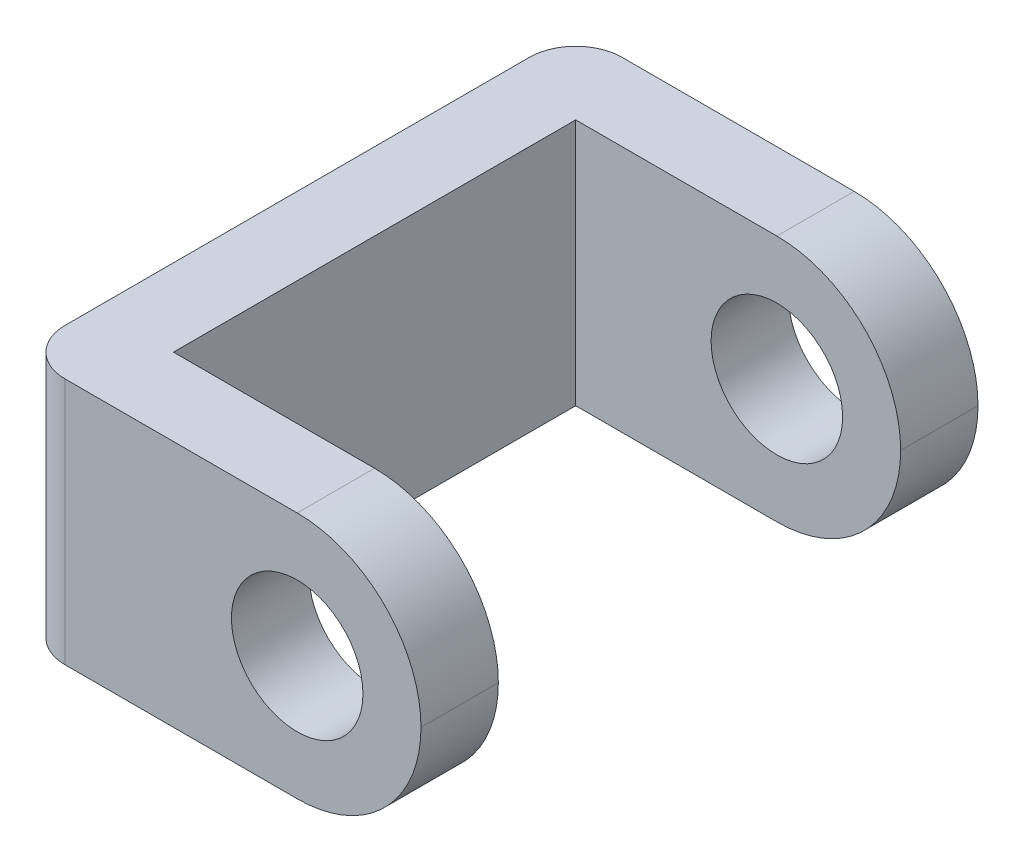
ISO-10303-21;
HEADER;
FILE_DESCRIPTION(('STEP AP214'),'2;1');
FILE_NAME('part.step','',(''),(''),'','','');
FILE_SCHEMA(('AUTOMOTIVE_DESIGN { 1 0 10303 214 1 1 1 1 }'));
ENDSEC;
DATA;
#1=APPLICATION_CONTEXT('core data for automotive mechanical design processes');
#2=APPLICATION_PROTOCOL_DEFINITION('international standard','automotive_design',2000,#1);
#3=PRODUCT_CONTEXT('',#1,'mechanical');
#4=PRODUCT('Part','Part','',(#3));
#5=PRODUCT_RELATED_PRODUCT_CATEGORY('part','',(#4));
#6=PRODUCT_DEFINITION_FORMATION('','',#4);
#7=PRODUCT_DEFINITION_CONTEXT('part definition',#1,'design');
#8=PRODUCT_DEFINITION('design','',#6,#7);
#9=PRODUCT_DEFINITION_SHAPE('','',#8);
#10=(LENGTH_UNIT() NAMED_UNIT(*) SI_UNIT(.MILLI.,.METRE.));
#11=(NAMED_UNIT(*) PLANE_ANGLE_UNIT() SI_UNIT($,.RADIAN.));
#12=(NAMED_UNIT(*) SI_UNIT($,.STERADIAN.) SOLID_ANGLE_UNIT());
#13=UNCERTAINTY_MEASURE_WITH_UNIT(LENGTH_MEASURE(1.E-05),#10,'distance_accuracy_value','');
#14=(GEOMETRIC_REPRESENTATION_CONTEXT(3) GLOBAL_UNCERTAINTY_ASSIGNED_CONTEXT((#13)) GLOBAL_UNIT_ASSIGNED_CONTEXT((#10,
#11,#12)) REPRESENTATION_CONTEXT('',''));
#15=CARTESIAN_POINT('',(0.,0.,0.));
#16=DIRECTION('',(0.,0.,1.));
#17=DIRECTION('',(1.,0.,0.));
#18=AXIS2_PLACEMENT_3D('',#15,#16,#17);
#19=CARTESIAN_POINT('',(26.,16.,-18.));
#20=DIRECTION('',(0.,0.,1.));
#21=DIRECTION('',(1.,0.,0.));
#22=AXIS2_PLACEMENT_3D('',#19,#20,#21);
#23=PLANE('',#22);
#24=CARTESIAN_POINT('',(18.,8.,-18.));
#25=DIRECTION('',(0.,0.,1.));
#26=DIRECTION('',(1.,0.,0.));
#27=AXIS2_PLACEMENT_3D('',#24,#25,#26);
#28=CIRCLE('',#27,4.25);
#29=CARTESIAN_POINT('',(22.25,8.,-18.));
#30=VERTEX_POINT('',#29);
#31=EDGE_CURVE('E294',#30,#30,#28,.T.);
#32=ORIENTED_EDGE('',*,*,#31,.T.);
#33=EDGE_LOOP('',(#32));
#34=FACE_BOUND('',#33,.T.);
#35=DIRECTION('',(-1.,0.,0.));
#36=VECTOR('',#35,1.);
#37=CARTESIAN_POINT('',(26.,0.,-18.));
#38=LINE('',#37,#36);
#39=CARTESIAN_POINT('',(18.,0.,-18.));
#40=VERTEX_POINT('',#39);
#41=CARTESIAN_POINT('',(3.,0.,-18.));
#42=VERTEX_POINT('',#41);
#43=EDGE_CURVE('E156',#40,#42,#38,.T.);
#44=ORIENTED_EDGE('',*,*,#43,.T.);
#45=DIRECTION('',(0.,-1.,0.));
#46=VECTOR('',#45,1.);
#47=CARTESIAN_POINT('',(3.,16.,-18.));
#48=LINE('',#47,#46);
#49=CARTESIAN_POINT('',(3.,16.,-18.));
#50=VERTEX_POINT('',#49);
#51=EDGE_CURVE('E11',#42,#50,#48,.F.);
#52=ORIENTED_EDGE('',*,*,#51,.T.);
#53=DIRECTION('',(-1.,0.,0.));
#54=VECTOR('',#53,1.);
#55=CARTESIAN_POINT('',(26.,16.,-18.));
#56=LINE('',#55,#54);
#57=CARTESIAN_POINT('',(18.,16.,-18.));
#58=VERTEX_POINT('',#57);
#59=EDGE_CURVE('E169',#58,#50,#56,.T.);
#60=ORIENTED_EDGE('',*,*,#59,.F.);
#61=CARTESIAN_POINT('',(18.,8.,-18.));
#62=DIRECTION('',(0.,0.,1.));
#63=DIRECTION('',(1.,0.,0.));
#64=AXIS2_PLACEMENT_3D('',#61,#62,#63);
#65=CIRCLE('',#64,8.);
#66=CARTESIAN_POINT('',(26.,8.,-18.));
#67=VERTEX_POINT('',#66);
#68=EDGE_CURVE('E145',#58,#67,#65,.F.);
#69=ORIENTED_EDGE('',*,*,#68,.T.);
#70=CARTESIAN_POINT('',(18.,8.,-18.));
#71=DIRECTION('',(0.,0.,1.));
#72=DIRECTION('',(1.,0.,0.));
#73=AXIS2_PLACEMENT_3D('',#70,#71,#72);
#74=CIRCLE('',#73,8.);
#75=EDGE_CURVE('E172',#67,#40,#74,.F.);
#76=ORIENTED_EDGE('',*,*,#75,.T.);
#77=EDGE_LOOP('',(#44,#52,#60,#69,#76));
#78=FACE_BOUND('',#77,.T.);
#79=ADVANCED_FACE('F34',(#34,#78),#23,.F.);
#80=CARTESIAN_POINT('',(0.,16.,-18.));
#81=DIRECTION('',(1.,0.,0.));
#82=DIRECTION('',(0.,0.,-1.));
#83=AXIS2_PLACEMENT_3D('',#80,#81,#82);
#84=PLANE('',#83);
#85=DIRECTION('',(0.,0.,1.));
#86=VECTOR('',#85,1.);
#87=CARTESIAN_POINT('',(0.,0.,-18.));
#88=LINE('',#87,#86);
#89=CARTESIAN_POINT('',(0.,0.,-15.));
#90=VERTEX_POINT('',#89);
#91=CARTESIAN_POINT('',(0.,0.,15.));
#92=VERTEX_POINT('',#91);
#93=EDGE_CURVE('E158',#90,#92,#88,.T.);
#94=ORIENTED_EDGE('',*,*,#93,.T.);
#95=DIRECTION('',(0.,-1.,0.));
#96=VECTOR('',#95,1.);
#97=CARTESIAN_POINT('',(0.,16.,15.));
#98=LINE('',#97,#96);
#99=CARTESIAN_POINT('',(0.,16.,15.));
#100=VERTEX_POINT('',#99);
#101=EDGE_CURVE('E56',#92,#100,#98,.F.);
#102=ORIENTED_EDGE('',*,*,#101,.T.);
#103=DIRECTION('',(0.,0.,1.));
#104=VECTOR('',#103,1.);
#105=CARTESIAN_POINT('',(0.,16.,-18.));
#106=LINE('',#105,#104);
#107=CARTESIAN_POINT('',(0.,16.,-15.));
#108=VERTEX_POINT('',#107);
#109=EDGE_CURVE('E217',#108,#100,#106,.T.);
#110=ORIENTED_EDGE('',*,*,#109,.F.);
#111=DIRECTION('',(0.,-1.,0.));
#112=VECTOR('',#111,1.);
#113=CARTESIAN_POINT('',(0.,16.,-15.));
#114=LINE('',#113,#112);
#115=EDGE_CURVE('E209',#108,#90,#114,.T.);
#116=ORIENTED_EDGE('',*,*,#115,.T.);
#117=EDGE_LOOP('',(#94,#102,#110,#116));
#118=FACE_BOUND('',#117,.T.);
#119=ADVANCED_FACE('F228',(#118),#84,.F.);
#120=CARTESIAN_POINT('',(0.,16.,18.));
#121=DIRECTION('',(0.,0.,-1.));
#122=DIRECTION('',(-1.,0.,0.));
#123=AXIS2_PLACEMENT_3D('',#120,#121,#122);
#124=PLANE('',#123);
#125=CARTESIAN_POINT('',(18.,8.,18.));
#126=DIRECTION('',(0.,0.,1.));
#127=DIRECTION('',(1.,0.,0.));
#128=AXIS2_PLACEMENT_3D('',#125,#126,#127);
#129=CIRCLE('',#128,4.25);
#130=CARTESIAN_POINT('',(22.25,8.,18.));
#131=VERTEX_POINT('',#130);
#132=EDGE_CURVE('E289',#131,#131,#129,.T.);
#133=ORIENTED_EDGE('',*,*,#132,.F.);
#134=EDGE_LOOP('',(#133));
#135=FACE_BOUND('',#134,.T.);
#136=DIRECTION('',(1.,0.,0.));
#137=VECTOR('',#136,1.);
#138=CARTESIAN_POINT('',(0.,16.,18.));
#139=LINE('',#138,#137);
#140=CARTESIAN_POINT('',(3.,16.,18.));
#141=VERTEX_POINT('',#140);
#142=CARTESIAN_POINT('',(18.,16.,18.));
#143=VERTEX_POINT('',#142);
#144=EDGE_CURVE('E136',#141,#143,#139,.T.);
#145=ORIENTED_EDGE('',*,*,#144,.F.);
#146=DIRECTION('',(0.,-1.,0.));
#147=VECTOR('',#146,1.);
#148=CARTESIAN_POINT('',(3.,16.,18.));
#149=LINE('',#148,#147);
#150=CARTESIAN_POINT('',(3.,0.,18.));
#151=VERTEX_POINT('',#150);
#152=EDGE_CURVE('E196',#141,#151,#149,.T.);
#153=ORIENTED_EDGE('',*,*,#152,.T.);
#154=DIRECTION('',(1.,0.,0.));
#155=VECTOR('',#154,1.);
#156=CARTESIAN_POINT('',(0.,0.,18.));
#157=LINE('',#156,#155);
#158=CARTESIAN_POINT('',(18.,0.,18.));
#159=VERTEX_POINT('',#158);
#160=EDGE_CURVE('E161',#151,#159,#157,.T.);
#161=ORIENTED_EDGE('',*,*,#160,.T.);
#162=CARTESIAN_POINT('',(18.,8.,18.));
#163=DIRECTION('',(0.,0.,-1.));
#164=DIRECTION('',(-1.,0.,0.));
#165=AXIS2_PLACEMENT_3D('',#162,#163,#164);
#166=CIRCLE('',#165,8.);
#167=CARTESIAN_POINT('',(26.,8.,18.));
#168=VERTEX_POINT('',#167);
#169=EDGE_CURVE('E194',#159,#168,#166,.F.);
#170=ORIENTED_EDGE('',*,*,#169,.T.);
#171=CARTESIAN_POINT('',(18.,8.,18.));
#172=DIRECTION('',(0.,0.,-1.));
#173=DIRECTION('',(-1.,0.,0.));
#174=AXIS2_PLACEMENT_3D('',#171,#172,#173);
#175=CIRCLE('',#174,8.);
#176=EDGE_CURVE('E191',#168,#143,#175,.F.);
#177=ORIENTED_EDGE('',*,*,#176,.T.);
#178=EDGE_LOOP('',(#145,#153,#161,#170,#177));
#179=FACE_BOUND('',#178,.T.);
#180=ADVANCED_FACE('F221',(#135,#179),#124,.F.);
#181=CARTESIAN_POINT('',(26.,16.,13.));
#182=DIRECTION('',(0.,0.,1.));
#183=DIRECTION('',(1.,0.,0.));
#184=AXIS2_PLACEMENT_3D('',#181,#182,#183);
#185=PLANE('',#184);
#186=CARTESIAN_POINT('',(18.,8.,13.));
#187=DIRECTION('',(0.,0.,1.));
#188=DIRECTION('',(1.,0.,0.));
#189=AXIS2_PLACEMENT_3D('',#186,#187,#188);
#190=CIRCLE('',#189,4.25);
#191=CARTESIAN_POINT('',(22.25,8.,13.));
#192=VERTEX_POINT('',#191);
#193=EDGE_CURVE('E202',#192,#192,#190,.T.);
#194=ORIENTED_EDGE('',*,*,#193,.T.);
#195=EDGE_LOOP('',(#194));
#196=FACE_BOUND('',#195,.T.);
#197=CARTESIAN_POINT('',(18.,8.,13.));
#198=DIRECTION('',(0.,0.,1.));
#199=DIRECTION('',(1.,0.,0.));
#200=AXIS2_PLACEMENT_3D('',#197,#198,#199);
#201=CIRCLE('',#200,8.);
#202=CARTESIAN_POINT('',(18.,16.,13.));
#203=VERTEX_POINT('',#202);
#204=CARTESIAN_POINT('',(26.,8.,13.));
#205=VERTEX_POINT('',#204);
#206=EDGE_CURVE('E187',#203,#205,#201,.F.);
#207=ORIENTED_EDGE('',*,*,#206,.T.);
#208=CARTESIAN_POINT('',(18.,8.,13.));
#209=DIRECTION('',(0.,0.,1.));
#210=DIRECTION('',(1.,0.,0.));
#211=AXIS2_PLACEMENT_3D('',#208,#209,#210);
#212=CIRCLE('',#211,8.);
#213=CARTESIAN_POINT('',(18.,0.,13.));
#214=VERTEX_POINT('',#213);
#215=EDGE_CURVE('E189',#205,#214,#212,.F.);
#216=ORIENTED_EDGE('',*,*,#215,.T.);
#217=DIRECTION('',(-1.,0.,0.));
#218=VECTOR('',#217,1.);
#219=CARTESIAN_POINT('',(26.,0.,13.));
#220=LINE('',#219,#218);
#221=CARTESIAN_POINT('',(5.,0.,13.));
#222=VERTEX_POINT('',#221);
#223=EDGE_CURVE('E142',#214,#222,#220,.T.);
#224=ORIENTED_EDGE('',*,*,#223,.T.);
#225=DIRECTION('',(0.,-1.,0.));
#226=VECTOR('',#225,1.);
#227=CARTESIAN_POINT('',(5.,16.,13.));
#228=LINE('',#227,#226);
#229=CARTESIAN_POINT('',(5.,16.,13.));
#230=VERTEX_POINT('',#229);
#231=EDGE_CURVE('E139',#230,#222,#228,.T.);
#232=ORIENTED_EDGE('',*,*,#231,.F.);
#233=DIRECTION('',(-1.,0.,0.));
#234=VECTOR('',#233,1.);
#235=CARTESIAN_POINT('',(26.,16.,13.));
#236=LINE('',#235,#234);
#237=EDGE_CURVE('E125',#203,#230,#236,.T.);
#238=ORIENTED_EDGE('',*,*,#237,.F.);
#239=EDGE_LOOP('',(#207,#216,#224,#232,#238));
#240=FACE_BOUND('',#239,.T.);
#241=ADVANCED_FACE('F140',(#196,#240),#185,.F.);
#242=CARTESIAN_POINT('',(5.,16.,13.));
#243=DIRECTION('',(-1.,0.,0.));
#244=DIRECTION('',(0.,0.,1.));
#245=AXIS2_PLACEMENT_3D('',#242,#243,#244);
#246=PLANE('',#245);
#247=DIRECTION('',(0.,0.,-1.));
#248=VECTOR('',#247,1.);
#249=CARTESIAN_POINT('',(5.,0.,13.));
#250=LINE('',#249,#248);
#251=CARTESIAN_POINT('',(5.,0.,-13.));
#252=VERTEX_POINT('',#251);
#253=EDGE_CURVE('E164',#222,#252,#250,.T.);
#254=ORIENTED_EDGE('',*,*,#253,.T.);
#255=DIRECTION('',(0.,-1.,0.));
#256=VECTOR('',#255,1.);
#257=CARTESIAN_POINT('',(5.,16.,-13.));
#258=LINE('',#257,#256);
#259=CARTESIAN_POINT('',(5.,16.,-13.));
#260=VERTEX_POINT('',#259);
#261=EDGE_CURVE('E146',#260,#252,#258,.T.);
#262=ORIENTED_EDGE('',*,*,#261,.F.);
#263=DIRECTION('',(0.,0.,-1.));
#264=VECTOR('',#263,1.);
#265=CARTESIAN_POINT('',(5.,16.,13.));
#266=LINE('',#265,#264);
#267=EDGE_CURVE('E130',#230,#260,#266,.T.);
#268=ORIENTED_EDGE('',*,*,#267,.F.);
#269=ORIENTED_EDGE('',*,*,#231,.T.);
#270=EDGE_LOOP('',(#254,#262,#268,#269));
#271=FACE_BOUND('',#270,.T.);
#272=ADVANCED_FACE('F148',(#271),#246,.F.);
#273=CARTESIAN_POINT('',(5.,16.,-13.));
#274=DIRECTION('',(0.,0.,-1.));
#275=DIRECTION('',(-1.,0.,0.));
#276=AXIS2_PLACEMENT_3D('',#273,#274,#275);
#277=PLANE('',#276);
#278=CARTESIAN_POINT('',(18.,8.,-13.));
#279=DIRECTION('',(0.,0.,-1.));
#280=DIRECTION('',(-1.,0.,0.));
#281=AXIS2_PLACEMENT_3D('',#278,#279,#280);
#282=CIRCLE('',#281,4.25);
#283=CARTESIAN_POINT('',(13.75,8.,-13.));
#284=VERTEX_POINT('',#283);
#285=EDGE_CURVE('E38',#284,#284,#282,.T.);
#286=ORIENTED_EDGE('',*,*,#285,.T.);
#287=EDGE_LOOP('',(#286));
#288=FACE_BOUND('',#287,.T.);
#289=DIRECTION('',(1.,0.,0.));
#290=VECTOR('',#289,1.);
#291=CARTESIAN_POINT('',(5.,0.,-13.));
#292=LINE('',#291,#290);
#293=CARTESIAN_POINT('',(18.,0.,-13.));
#294=VERTEX_POINT('',#293);
#295=EDGE_CURVE('E166',#252,#294,#292,.T.);
#296=ORIENTED_EDGE('',*,*,#295,.T.);
#297=CARTESIAN_POINT('',(18.,8.,-13.));
#298=DIRECTION('',(0.,0.,-1.));
#299=DIRECTION('',(-1.,0.,0.));
#300=AXIS2_PLACEMENT_3D('',#297,#298,#299);
#301=CIRCLE('',#300,8.);
#302=CARTESIAN_POINT('',(26.,8.,-13.));
#303=VERTEX_POINT('',#302);
#304=EDGE_CURVE('E182',#294,#303,#301,.F.);
#305=ORIENTED_EDGE('',*,*,#304,.T.);
#306=CARTESIAN_POINT('',(18.,8.,-13.));
#307=DIRECTION('',(0.,0.,-1.));
#308=DIRECTION('',(-1.,0.,0.));
#309=AXIS2_PLACEMENT_3D('',#306,#307,#308);
#310=CIRCLE('',#309,8.);
#311=CARTESIAN_POINT('',(18.,16.,-13.));
#312=VERTEX_POINT('',#311);
#313=EDGE_CURVE('E180',#303,#312,#310,.F.);
#314=ORIENTED_EDGE('',*,*,#313,.T.);
#315=DIRECTION('',(1.,0.,0.));
#316=VECTOR('',#315,1.);
#317=CARTESIAN_POINT('',(5.,16.,-13.));
#318=LINE('',#317,#316);
#319=EDGE_CURVE('E151',#260,#312,#318,.T.);
#320=ORIENTED_EDGE('',*,*,#319,.F.);
#321=ORIENTED_EDGE('',*,*,#261,.T.);
#322=EDGE_LOOP('',(#296,#305,#314,#320,#321));
#323=FACE_BOUND('',#322,.T.);
#324=ADVANCED_FACE('F241',(#288,#323),#277,.F.);
#325=CARTESIAN_POINT('',(0.,16.,0.));
#326=DIRECTION('',(0.,1.,0.));
#327=DIRECTION('',(0.,0.,1.));
#328=AXIS2_PLACEMENT_3D('',#325,#326,#327);
#329=PLANE('',#328);
#330=ORIENTED_EDGE('',*,*,#109,.T.);
#331=CARTESIAN_POINT('',(3.,16.,15.));
#332=DIRECTION('',(0.,1.,0.));
#333=DIRECTION('',(0.,0.,1.));
#334=AXIS2_PLACEMENT_3D('',#331,#332,#333);
#335=CIRCLE('',#334,3.);
#336=EDGE_CURVE('E43',#100,#141,#335,.T.);
#337=ORIENTED_EDGE('',*,*,#336,.T.);
#338=ORIENTED_EDGE('',*,*,#144,.T.);
#339=DIRECTION('',(0.,0.,-1.));
#340=VECTOR('',#339,1.);
#341=CARTESIAN_POINT('',(18.,16.,13.));
#342=LINE('',#341,#340);
#343=EDGE_CURVE('E133',#143,#203,#342,.T.);
#344=ORIENTED_EDGE('',*,*,#343,.T.);
#345=ORIENTED_EDGE('',*,*,#237,.T.);
#346=ORIENTED_EDGE('',*,*,#267,.T.);
#347=ORIENTED_EDGE('',*,*,#319,.T.);
#348=DIRECTION('',(0.,0.,-1.));
#349=VECTOR('',#348,1.);
#350=CARTESIAN_POINT('',(18.,16.,-18.));
#351=LINE('',#350,#349);
#352=EDGE_CURVE('E185',#312,#58,#351,.T.);
#353=ORIENTED_EDGE('',*,*,#352,.T.);
#354=ORIENTED_EDGE('',*,*,#59,.T.);
#355=CARTESIAN_POINT('',(3.,16.,-15.));
#356=DIRECTION('',(0.,1.,0.));
#357=DIRECTION('',(0.,0.,1.));
#358=AXIS2_PLACEMENT_3D('',#355,#356,#357);
#359=CIRCLE('',#358,3.);
#360=EDGE_CURVE('E213',#50,#108,#359,.T.);
#361=ORIENTED_EDGE('',*,*,#360,.T.);
#362=EDGE_LOOP('',(#330,#337,#338,#344,#345,#346,#347,#353,#354,#361));
#363=FACE_BOUND('',#362,.T.);
#364=ADVANCED_FACE('F127',(#363),#329,.T.);
#365=CARTESIAN_POINT('',(0.,0.,0.));
#366=DIRECTION('',(0.,1.,0.));
#367=DIRECTION('',(0.,0.,1.));
#368=AXIS2_PLACEMENT_3D('',#365,#366,#367);
#369=PLANE('',#368);
#370=ORIENTED_EDGE('',*,*,#160,.F.);
#371=CARTESIAN_POINT('',(3.,0.,15.));
#372=DIRECTION('',(0.,1.,0.));
#373=DIRECTION('',(0.,0.,1.));
#374=AXIS2_PLACEMENT_3D('',#371,#372,#373);
#375=CIRCLE('',#374,3.);
#376=EDGE_CURVE('E207',#151,#92,#375,.F.);
#377=ORIENTED_EDGE('',*,*,#376,.T.);
#378=ORIENTED_EDGE('',*,*,#93,.F.);
#379=CARTESIAN_POINT('',(3.,0.,-15.));
#380=DIRECTION('',(0.,1.,0.));
#381=DIRECTION('',(0.,0.,1.));
#382=AXIS2_PLACEMENT_3D('',#379,#380,#381);
#383=CIRCLE('',#382,3.);
#384=EDGE_CURVE('E205',#90,#42,#383,.F.);
#385=ORIENTED_EDGE('',*,*,#384,.T.);
#386=ORIENTED_EDGE('',*,*,#43,.F.);
#387=DIRECTION('',(0.,0.,-1.));
#388=VECTOR('',#387,1.);
#389=CARTESIAN_POINT('',(18.,0.,0.));
#390=LINE('',#389,#388);
#391=EDGE_CURVE('E177',#40,#294,#390,.F.);
#392=ORIENTED_EDGE('',*,*,#391,.T.);
#393=ORIENTED_EDGE('',*,*,#295,.F.);
#394=ORIENTED_EDGE('',*,*,#253,.F.);
#395=ORIENTED_EDGE('',*,*,#223,.F.);
#396=DIRECTION('',(0.,0.,-1.));
#397=VECTOR('',#396,1.);
#398=CARTESIAN_POINT('',(18.,0.,0.));
#399=LINE('',#398,#397);
#400=EDGE_CURVE('E174',#214,#159,#399,.F.);
#401=ORIENTED_EDGE('',*,*,#400,.T.);
#402=EDGE_LOOP('',(#370,#377,#378,#385,#386,#392,#393,#394,#395,#401));
#403=FACE_BOUND('',#402,.T.);
#404=ADVANCED_FACE('F227',(#403),#369,.F.);
#405=CARTESIAN_POINT('',(18.,8.,0.));
#406=DIRECTION('',(0.,0.,1.));
#407=DIRECTION('',(1.,0.,0.));
#408=AXIS2_PLACEMENT_3D('',#405,#406,#407);
#409=CYLINDRICAL_SURFACE('',#408,8.);
#410=ORIENTED_EDGE('',*,*,#352,.F.);
#411=ORIENTED_EDGE('',*,*,#313,.F.);
#412=DIRECTION('',(0.,0.,-1.));
#413=VECTOR('',#412,1.);
#414=CARTESIAN_POINT('',(26.,8.,-13.));
#415=LINE('',#414,#413);
#416=EDGE_CURVE('E159',#67,#303,#415,.F.);
#417=ORIENTED_EDGE('',*,*,#416,.F.);
#418=ORIENTED_EDGE('',*,*,#68,.F.);
#419=EDGE_LOOP('',(#410,#411,#417,#418));
#420=FACE_BOUND('',#419,.T.);
#421=ADVANCED_FACE('F245',(#420),#409,.T.);
#422=CARTESIAN_POINT('',(18.,8.,-13.));
#423=DIRECTION('',(0.,0.,-1.));
#424=DIRECTION('',(-1.,0.,0.));
#425=AXIS2_PLACEMENT_3D('',#422,#423,#424);
#426=CYLINDRICAL_SURFACE('',#425,8.);
#427=ORIENTED_EDGE('',*,*,#304,.F.);
#428=ORIENTED_EDGE('',*,*,#391,.F.);
#429=ORIENTED_EDGE('',*,*,#75,.F.);
#430=ORIENTED_EDGE('',*,*,#416,.T.);
#431=EDGE_LOOP('',(#427,#428,#429,#430));
#432=FACE_BOUND('',#431,.T.);
#433=ADVANCED_FACE('F238',(#432),#426,.T.);
#434=CARTESIAN_POINT('',(18.,8.,0.));
#435=DIRECTION('',(0.,0.,1.));
#436=DIRECTION('',(1.,0.,0.));
#437=AXIS2_PLACEMENT_3D('',#434,#435,#436);
#438=CYLINDRICAL_SURFACE('',#437,8.);
#439=ORIENTED_EDGE('',*,*,#343,.F.);
#440=ORIENTED_EDGE('',*,*,#176,.F.);
#441=DIRECTION('',(0.,0.,-1.));
#442=VECTOR('',#441,1.);
#443=CARTESIAN_POINT('',(26.,8.,18.));
#444=LINE('',#443,#442);
#445=EDGE_CURVE('E199',#205,#168,#444,.F.);
#446=ORIENTED_EDGE('',*,*,#445,.F.);
#447=ORIENTED_EDGE('',*,*,#206,.F.);
#448=EDGE_LOOP('',(#439,#440,#446,#447));
#449=FACE_BOUND('',#448,.T.);
#450=ADVANCED_FACE('F252',(#449),#438,.T.);
#451=CARTESIAN_POINT('',(18.,8.,18.));
#452=DIRECTION('',(0.,0.,-1.));
#453=DIRECTION('',(-1.,0.,0.));
#454=AXIS2_PLACEMENT_3D('',#451,#452,#453);
#455=CYLINDRICAL_SURFACE('',#454,8.);
#456=ORIENTED_EDGE('',*,*,#169,.F.);
#457=ORIENTED_EDGE('',*,*,#400,.F.);
#458=ORIENTED_EDGE('',*,*,#215,.F.);
#459=ORIENTED_EDGE('',*,*,#445,.T.);
#460=EDGE_LOOP('',(#456,#457,#458,#459));
#461=FACE_BOUND('',#460,.T.);
#462=ADVANCED_FACE('F308',(#461),#455,.T.);
#463=CARTESIAN_POINT('',(3.,16.,15.));
#464=DIRECTION('',(0.,-1.,0.));
#465=DIRECTION('',(0.,0.,-1.));
#466=AXIS2_PLACEMENT_3D('',#463,#464,#465);
#467=CYLINDRICAL_SURFACE('',#466,3.);
#468=ORIENTED_EDGE('',*,*,#336,.F.);
#469=ORIENTED_EDGE('',*,*,#101,.F.);
#470=ORIENTED_EDGE('',*,*,#376,.F.);
#471=ORIENTED_EDGE('',*,*,#152,.F.);
#472=EDGE_LOOP('',(#468,#469,#470,#471));
#473=FACE_BOUND('',#472,.T.);
#474=ADVANCED_FACE('F224',(#473),#467,.T.);
#475=CARTESIAN_POINT('',(3.,16.,-15.));
#476=DIRECTION('',(0.,-1.,0.));
#477=DIRECTION('',(0.,0.,-1.));
#478=AXIS2_PLACEMENT_3D('',#475,#476,#477);
#479=CYLINDRICAL_SURFACE('',#478,3.);
#480=ORIENTED_EDGE('',*,*,#360,.F.);
#481=ORIENTED_EDGE('',*,*,#51,.F.);
#482=ORIENTED_EDGE('',*,*,#384,.F.);
#483=ORIENTED_EDGE('',*,*,#115,.F.);
#484=EDGE_LOOP('',(#480,#481,#482,#483));
#485=FACE_BOUND('',#484,.T.);
#486=ADVANCED_FACE('F36',(#485),#479,.T.);
#487=CARTESIAN_POINT('',(18.,8.,-18.));
#488=DIRECTION('',(0.,0.,1.));
#489=DIRECTION('',(1.,0.,0.));
#490=AXIS2_PLACEMENT_3D('',#487,#488,#489);
#491=CYLINDRICAL_SURFACE('',#490,4.25);
#492=ORIENTED_EDGE('',*,*,#31,.F.);
#493=EDGE_LOOP('',(#492));
#494=FACE_BOUND('',#493,.T.);
#495=ORIENTED_EDGE('',*,*,#285,.F.);
#496=EDGE_LOOP('',(#495));
#497=FACE_BOUND('',#496,.T.);
#498=ADVANCED_FACE('F280',(#494,#497),#491,.F.);
#499=ORIENTED_EDGE('',*,*,#132,.T.);
#500=EDGE_LOOP('',(#499));
#501=FACE_BOUND('',#500,.T.);
#502=ORIENTED_EDGE('',*,*,#193,.F.);
#503=EDGE_LOOP('',(#502));
#504=FACE_BOUND('',#503,.T.);
#505=ADVANCED_FACE('F278',(#501,#504),#491,.F.);
#506=CLOSED_SHELL('',(#79,#119,#180,#241,#272,#324,#364,#404,#421,#433,#450,#462,#474,#486,#498,#505));
#507=MANIFOLD_SOLID_BREP('B2',#506);
#508=ADVANCED_BREP_SHAPE_REPRESENTATION('',(#18,#507),#14);
#509=SHAPE_DEFINITION_REPRESENTATION(#9,#508);
ENDSEC;
END-ISO-10303-21;
